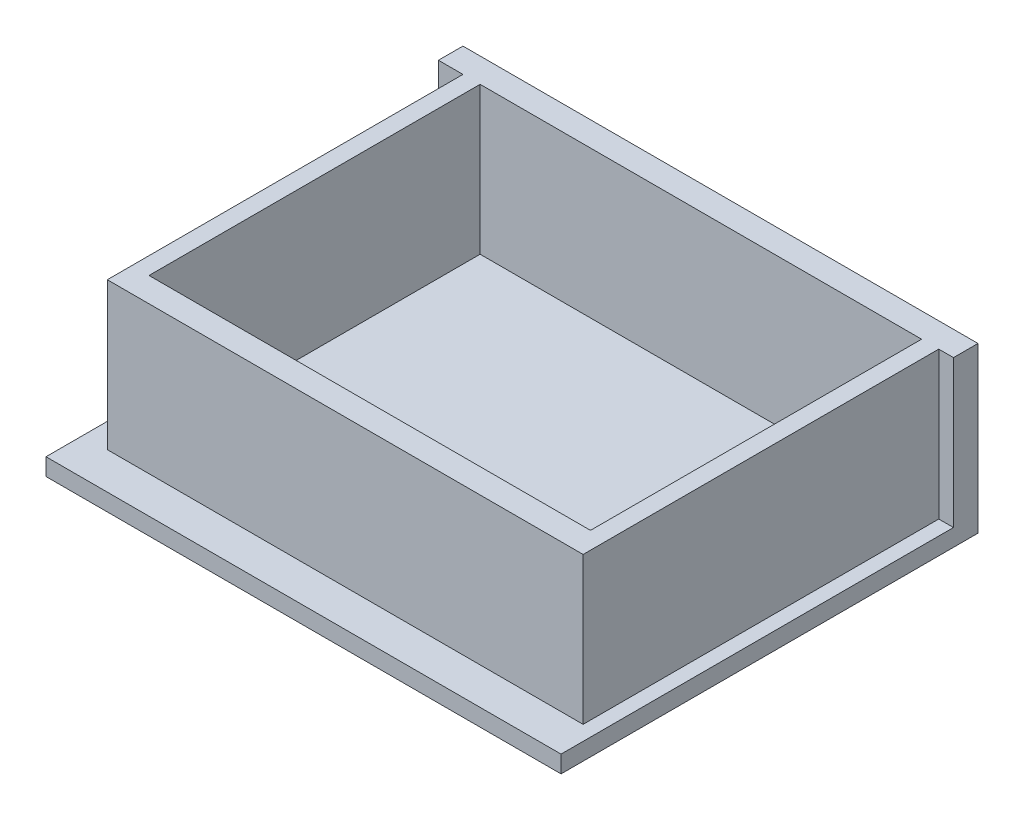
ISO-10303-21;
HEADER;
FILE_DESCRIPTION(('STEP AP214'),'2;1');
FILE_NAME('part.step','',(''),(''),'','','');
FILE_SCHEMA(('AUTOMOTIVE_DESIGN { 1 0 10303 214 1 1 1 1 }'));
ENDSEC;
DATA;
#1=APPLICATION_CONTEXT('core data for automotive mechanical design processes');
#2=APPLICATION_PROTOCOL_DEFINITION('international standard','automotive_design',2000,#1);
#3=PRODUCT_CONTEXT('',#1,'mechanical');
#4=PRODUCT('Part','Part','',(#3));
#5=PRODUCT_RELATED_PRODUCT_CATEGORY('part','',(#4));
#6=PRODUCT_DEFINITION_FORMATION('','',#4);
#7=PRODUCT_DEFINITION_CONTEXT('part definition',#1,'design');
#8=PRODUCT_DEFINITION('design','',#6,#7);
#9=PRODUCT_DEFINITION_SHAPE('','',#8);
#10=(LENGTH_UNIT() NAMED_UNIT(*) SI_UNIT(.MILLI.,.METRE.));
#11=(NAMED_UNIT(*) PLANE_ANGLE_UNIT() SI_UNIT($,.RADIAN.));
#12=(NAMED_UNIT(*) SI_UNIT($,.STERADIAN.) SOLID_ANGLE_UNIT());
#13=UNCERTAINTY_MEASURE_WITH_UNIT(LENGTH_MEASURE(1.E-05),#10,'distance_accuracy_value','');
#14=(GEOMETRIC_REPRESENTATION_CONTEXT(3) GLOBAL_UNCERTAINTY_ASSIGNED_CONTEXT((#13)) GLOBAL_UNIT_ASSIGNED_CONTEXT((#10,
#11,#12)) REPRESENTATION_CONTEXT('',''));
#15=CARTESIAN_POINT('',(0.,0.,0.));
#16=DIRECTION('',(0.,0.,1.));
#17=DIRECTION('',(1.,0.,0.));
#18=AXIS2_PLACEMENT_3D('',#15,#16,#17);
#19=CARTESIAN_POINT('',(0.,7.,0.));
#20=DIRECTION('',(0.,-1.,0.));
#21=DIRECTION('',(0.,0.,-1.));
#22=AXIS2_PLACEMENT_3D('',#19,#20,#21);
#23=PLANE('',#22);
#24=DIRECTION('',(1.,0.,0.));
#25=VECTOR('',#24,1.);
#26=CARTESIAN_POINT('',(0.,7.,-160.));
#27=LINE('',#26,#25);
#28=CARTESIAN_POINT('',(0.,7.,-160.));
#29=VERTEX_POINT('',#28);
#30=CARTESIAN_POINT('',(10.,7.,-160.));
#31=VERTEX_POINT('',#30);
#32=EDGE_CURVE('E205',#29,#31,#27,.T.);
#33=ORIENTED_EDGE('',*,*,#32,.F.);
#34=DIRECTION('',(0.,0.,1.));
#35=VECTOR('',#34,1.);
#36=CARTESIAN_POINT('',(0.,7.,0.));
#37=LINE('',#36,#35);
#38=CARTESIAN_POINT('',(0.,7.,0.));
#39=VERTEX_POINT('',#38);
#40=EDGE_CURVE('E245',#29,#39,#37,.T.);
#41=ORIENTED_EDGE('',*,*,#40,.T.);
#42=DIRECTION('',(1.,0.,0.));
#43=VECTOR('',#42,1.);
#44=CARTESIAN_POINT('',(0.,7.,0.));
#45=LINE('',#44,#43);
#46=CARTESIAN_POINT('',(210.,7.,0.));
#47=VERTEX_POINT('',#46);
#48=EDGE_CURVE('E244',#39,#47,#45,.T.);
#49=ORIENTED_EDGE('',*,*,#48,.T.);
#50=DIRECTION('',(0.,0.,-1.));
#51=VECTOR('',#50,1.);
#52=CARTESIAN_POINT('',(210.,7.,0.));
#53=LINE('',#52,#51);
#54=CARTESIAN_POINT('',(210.,7.,-160.));
#55=VERTEX_POINT('',#54);
#56=EDGE_CURVE('E206',#47,#55,#53,.T.);
#57=ORIENTED_EDGE('',*,*,#56,.T.);
#58=DIRECTION('',(1.,0.,0.));
#59=VECTOR('',#58,1.);
#60=CARTESIAN_POINT('',(0.,7.,-160.));
#61=LINE('',#60,#59);
#62=CARTESIAN_POINT('',(204.,7.,-160.));
#63=VERTEX_POINT('',#62);
#64=EDGE_CURVE('E198',#63,#55,#61,.T.);
#65=ORIENTED_EDGE('',*,*,#64,.F.);
#66=DIRECTION('',(0.,0.,-1.));
#67=VECTOR('',#66,1.);
#68=CARTESIAN_POINT('',(204.,7.,0.));
#69=LINE('',#68,#67);
#70=CARTESIAN_POINT('',(204.,7.,-15.));
#71=VERTEX_POINT('',#70);
#72=EDGE_CURVE('E195',#71,#63,#69,.T.);
#73=ORIENTED_EDGE('',*,*,#72,.F.);
#74=DIRECTION('',(-1.,0.,0.));
#75=VECTOR('',#74,1.);
#76=CARTESIAN_POINT('',(0.,7.,-15.));
#77=LINE('',#76,#75);
#78=CARTESIAN_POINT('',(10.,7.,-15.));
#79=VERTEX_POINT('',#78);
#80=EDGE_CURVE('E161',#71,#79,#77,.T.);
#81=ORIENTED_EDGE('',*,*,#80,.T.);
#82=DIRECTION('',(0.,0.,1.));
#83=VECTOR('',#82,1.);
#84=CARTESIAN_POINT('',(10.,7.,0.));
#85=LINE('',#84,#83);
#86=EDGE_CURVE('E163',#31,#79,#85,.T.);
#87=ORIENTED_EDGE('',*,*,#86,.F.);
#88=EDGE_LOOP('',(#33,#41,#49,#57,#65,#73,#81,#87));
#89=FACE_BOUND('',#88,.T.);
#90=ADVANCED_FACE('F35',(#89),#23,.F.);
#91=CARTESIAN_POINT('',(0.,7.,0.));
#92=DIRECTION('',(1.,0.,0.));
#93=DIRECTION('',(0.,0.,-1.));
#94=AXIS2_PLACEMENT_3D('',#91,#92,#93);
#95=PLANE('',#94);
#96=DIRECTION('',(0.,0.,1.));
#97=VECTOR('',#96,1.);
#98=CARTESIAN_POINT('',(0.,0.,0.));
#99=LINE('',#98,#97);
#100=CARTESIAN_POINT('',(0.,0.,-170.));
#101=VERTEX_POINT('',#100);
#102=CARTESIAN_POINT('',(0.,0.,0.));
#103=VERTEX_POINT('',#102);
#104=EDGE_CURVE('E237',#101,#103,#99,.T.);
#105=ORIENTED_EDGE('',*,*,#104,.T.);
#106=DIRECTION('',(0.,-1.,0.));
#107=VECTOR('',#106,1.);
#108=CARTESIAN_POINT('',(0.,7.,0.));
#109=LINE('',#108,#107);
#110=EDGE_CURVE('E11',#39,#103,#109,.T.);
#111=ORIENTED_EDGE('',*,*,#110,.F.);
#112=ORIENTED_EDGE('',*,*,#40,.F.);
#113=DIRECTION('',(0.,-1.,0.));
#114=VECTOR('',#113,1.);
#115=CARTESIAN_POINT('',(0.,67.,-160.));
#116=LINE('',#115,#114);
#117=CARTESIAN_POINT('',(0.,67.,-160.));
#118=VERTEX_POINT('',#117);
#119=EDGE_CURVE('E213',#118,#29,#116,.T.);
#120=ORIENTED_EDGE('',*,*,#119,.F.);
#121=DIRECTION('',(0.,0.,1.));
#122=VECTOR('',#121,1.);
#123=CARTESIAN_POINT('',(0.,67.,0.));
#124=LINE('',#123,#122);
#125=CARTESIAN_POINT('',(0.,67.,-170.));
#126=VERTEX_POINT('',#125);
#127=EDGE_CURVE('E179',#126,#118,#124,.T.);
#128=ORIENTED_EDGE('',*,*,#127,.F.);
#129=DIRECTION('',(0.,-1.,0.));
#130=VECTOR('',#129,1.);
#131=CARTESIAN_POINT('',(0.,7.,-170.));
#132=LINE('',#131,#130);
#133=EDGE_CURVE('E253',#126,#101,#132,.T.);
#134=ORIENTED_EDGE('',*,*,#133,.T.);
#135=EDGE_LOOP('',(#105,#111,#112,#120,#128,#134));
#136=FACE_BOUND('',#135,.T.);
#137=ADVANCED_FACE('F37',(#136),#95,.F.);
#138=CARTESIAN_POINT('',(0.,7.,0.));
#139=DIRECTION('',(0.,0.,-1.));
#140=DIRECTION('',(-1.,0.,0.));
#141=AXIS2_PLACEMENT_3D('',#138,#139,#140);
#142=PLANE('',#141);
#143=DIRECTION('',(1.,0.,0.));
#144=VECTOR('',#143,1.);
#145=CARTESIAN_POINT('',(0.,0.,0.));
#146=LINE('',#145,#144);
#147=CARTESIAN_POINT('',(210.,0.,0.));
#148=VERTEX_POINT('',#147);
#149=EDGE_CURVE('E259',#103,#148,#146,.T.);
#150=ORIENTED_EDGE('',*,*,#149,.T.);
#151=DIRECTION('',(0.,-1.,0.));
#152=VECTOR('',#151,1.);
#153=CARTESIAN_POINT('',(210.,7.,0.));
#154=LINE('',#153,#152);
#155=EDGE_CURVE('E44',#47,#148,#154,.T.);
#156=ORIENTED_EDGE('',*,*,#155,.F.);
#157=ORIENTED_EDGE('',*,*,#48,.F.);
#158=ORIENTED_EDGE('',*,*,#110,.T.);
#159=EDGE_LOOP('',(#150,#156,#157,#158));
#160=FACE_BOUND('',#159,.T.);
#161=ADVANCED_FACE('F275',(#160),#142,.F.);
#162=CARTESIAN_POINT('',(210.,7.,0.));
#163=DIRECTION('',(-1.,0.,0.));
#164=DIRECTION('',(0.,0.,1.));
#165=AXIS2_PLACEMENT_3D('',#162,#163,#164);
#166=PLANE('',#165);
#167=DIRECTION('',(0.,0.,-1.));
#168=VECTOR('',#167,1.);
#169=CARTESIAN_POINT('',(210.,0.,0.));
#170=LINE('',#169,#168);
#171=CARTESIAN_POINT('',(210.,0.,-170.));
#172=VERTEX_POINT('',#171);
#173=EDGE_CURVE('E257',#148,#172,#170,.T.);
#174=ORIENTED_EDGE('',*,*,#173,.T.);
#175=DIRECTION('',(0.,-1.,0.));
#176=VECTOR('',#175,1.);
#177=CARTESIAN_POINT('',(210.,7.,-170.));
#178=LINE('',#177,#176);
#179=CARTESIAN_POINT('',(210.,67.,-170.));
#180=VERTEX_POINT('',#179);
#181=EDGE_CURVE('E250',#180,#172,#178,.T.);
#182=ORIENTED_EDGE('',*,*,#181,.F.);
#183=DIRECTION('',(0.,0.,-1.));
#184=VECTOR('',#183,1.);
#185=CARTESIAN_POINT('',(210.,67.,0.));
#186=LINE('',#185,#184);
#187=CARTESIAN_POINT('',(210.,67.,-160.));
#188=VERTEX_POINT('',#187);
#189=EDGE_CURVE('E173',#188,#180,#186,.T.);
#190=ORIENTED_EDGE('',*,*,#189,.F.);
#191=DIRECTION('',(0.,-1.,0.));
#192=VECTOR('',#191,1.);
#193=CARTESIAN_POINT('',(210.,67.,-160.));
#194=LINE('',#193,#192);
#195=EDGE_CURVE('E209',#188,#55,#194,.T.);
#196=ORIENTED_EDGE('',*,*,#195,.T.);
#197=ORIENTED_EDGE('',*,*,#56,.F.);
#198=ORIENTED_EDGE('',*,*,#155,.T.);
#199=EDGE_LOOP('',(#174,#182,#190,#196,#197,#198));
#200=FACE_BOUND('',#199,.T.);
#201=ADVANCED_FACE('F284',(#200),#166,.F.);
#202=CARTESIAN_POINT('',(0.,7.,-170.));
#203=DIRECTION('',(0.,0.,1.));
#204=DIRECTION('',(1.,0.,0.));
#205=AXIS2_PLACEMENT_3D('',#202,#203,#204);
#206=PLANE('',#205);
#207=DIRECTION('',(-1.,0.,0.));
#208=VECTOR('',#207,1.);
#209=CARTESIAN_POINT('',(0.,0.,-170.));
#210=LINE('',#209,#208);
#211=EDGE_CURVE('E246',#172,#101,#210,.T.);
#212=ORIENTED_EDGE('',*,*,#211,.T.);
#213=ORIENTED_EDGE('',*,*,#133,.F.);
#214=DIRECTION('',(-1.,0.,0.));
#215=VECTOR('',#214,1.);
#216=CARTESIAN_POINT('',(0.,67.,-170.));
#217=LINE('',#216,#215);
#218=EDGE_CURVE('E176',#180,#126,#217,.T.);
#219=ORIENTED_EDGE('',*,*,#218,.F.);
#220=ORIENTED_EDGE('',*,*,#181,.T.);
#221=EDGE_LOOP('',(#212,#213,#219,#220));
#222=FACE_BOUND('',#221,.T.);
#223=ADVANCED_FACE('F287',(#222),#206,.F.);
#224=CARTESIAN_POINT('',(0.,0.,0.));
#225=DIRECTION('',(0.,-1.,0.));
#226=DIRECTION('',(0.,0.,-1.));
#227=AXIS2_PLACEMENT_3D('',#224,#225,#226);
#228=PLANE('',#227);
#229=ORIENTED_EDGE('',*,*,#104,.F.);
#230=ORIENTED_EDGE('',*,*,#211,.F.);
#231=ORIENTED_EDGE('',*,*,#173,.F.);
#232=ORIENTED_EDGE('',*,*,#149,.F.);
#233=EDGE_LOOP('',(#229,#230,#231,#232));
#234=FACE_BOUND('',#233,.T.);
#235=ADVANCED_FACE('F270',(#234),#228,.T.);
#236=CARTESIAN_POINT('',(204.,67.,0.));
#237=DIRECTION('',(-1.,0.,0.));
#238=DIRECTION('',(0.,0.,1.));
#239=AXIS2_PLACEMENT_3D('',#236,#237,#238);
#240=PLANE('',#239);
#241=ORIENTED_EDGE('',*,*,#72,.T.);
#242=DIRECTION('',(0.,-1.,0.));
#243=VECTOR('',#242,1.);
#244=CARTESIAN_POINT('',(204.,67.,-160.));
#245=LINE('',#244,#243);
#246=CARTESIAN_POINT('',(204.,67.,-160.));
#247=VERTEX_POINT('',#246);
#248=EDGE_CURVE('E212',#247,#63,#245,.T.);
#249=ORIENTED_EDGE('',*,*,#248,.F.);
#250=DIRECTION('',(0.,0.,-1.));
#251=VECTOR('',#250,1.);
#252=CARTESIAN_POINT('',(204.,67.,0.));
#253=LINE('',#252,#251);
#254=CARTESIAN_POINT('',(204.,67.,-15.));
#255=VERTEX_POINT('',#254);
#256=EDGE_CURVE('E168',#255,#247,#253,.T.);
#257=ORIENTED_EDGE('',*,*,#256,.F.);
#258=DIRECTION('',(0.,-1.,0.));
#259=VECTOR('',#258,1.);
#260=CARTESIAN_POINT('',(204.,67.,-15.));
#261=LINE('',#260,#259);
#262=EDGE_CURVE('E144',#255,#71,#261,.T.);
#263=ORIENTED_EDGE('',*,*,#262,.T.);
#264=EDGE_LOOP('',(#241,#249,#257,#263));
#265=FACE_BOUND('',#264,.T.);
#266=ADVANCED_FACE('F294',(#265),#240,.F.);
#267=CARTESIAN_POINT('',(0.,67.,-160.));
#268=DIRECTION('',(0.,0.,-1.));
#269=DIRECTION('',(-1.,0.,0.));
#270=AXIS2_PLACEMENT_3D('',#267,#268,#269);
#271=PLANE('',#270);
#272=ORIENTED_EDGE('',*,*,#64,.T.);
#273=ORIENTED_EDGE('',*,*,#195,.F.);
#274=DIRECTION('',(1.,0.,0.));
#275=VECTOR('',#274,1.);
#276=CARTESIAN_POINT('',(0.,67.,-160.));
#277=LINE('',#276,#275);
#278=EDGE_CURVE('E171',#247,#188,#277,.T.);
#279=ORIENTED_EDGE('',*,*,#278,.F.);
#280=ORIENTED_EDGE('',*,*,#248,.T.);
#281=EDGE_LOOP('',(#272,#273,#279,#280));
#282=FACE_BOUND('',#281,.T.);
#283=ADVANCED_FACE('F281',(#282),#271,.F.);
#284=CARTESIAN_POINT('',(0.,67.,-160.));
#285=DIRECTION('',(0.,0.,-1.));
#286=DIRECTION('',(-1.,0.,0.));
#287=AXIS2_PLACEMENT_3D('',#284,#285,#286);
#288=PLANE('',#287);
#289=ORIENTED_EDGE('',*,*,#32,.T.);
#290=DIRECTION('',(0.,-1.,0.));
#291=VECTOR('',#290,1.);
#292=CARTESIAN_POINT('',(10.,67.,-160.));
#293=LINE('',#292,#291);
#294=CARTESIAN_POINT('',(10.,67.,-160.));
#295=VERTEX_POINT('',#294);
#296=EDGE_CURVE('E220',#295,#31,#293,.T.);
#297=ORIENTED_EDGE('',*,*,#296,.F.);
#298=DIRECTION('',(1.,0.,0.));
#299=VECTOR('',#298,1.);
#300=CARTESIAN_POINT('',(0.,67.,-160.));
#301=LINE('',#300,#299);
#302=EDGE_CURVE('E181',#118,#295,#301,.T.);
#303=ORIENTED_EDGE('',*,*,#302,.F.);
#304=ORIENTED_EDGE('',*,*,#119,.T.);
#305=EDGE_LOOP('',(#289,#297,#303,#304));
#306=FACE_BOUND('',#305,.T.);
#307=ADVANCED_FACE('F333',(#306),#288,.F.);
#308=CARTESIAN_POINT('',(10.,67.,0.));
#309=DIRECTION('',(1.,0.,0.));
#310=DIRECTION('',(0.,0.,-1.));
#311=AXIS2_PLACEMENT_3D('',#308,#309,#310);
#312=PLANE('',#311);
#313=ORIENTED_EDGE('',*,*,#86,.T.);
#314=DIRECTION('',(0.,-1.,0.));
#315=VECTOR('',#314,1.);
#316=CARTESIAN_POINT('',(10.,67.,-15.));
#317=LINE('',#316,#315);
#318=CARTESIAN_POINT('',(10.,67.,-15.));
#319=VERTEX_POINT('',#318);
#320=EDGE_CURVE('E225',#319,#79,#317,.T.);
#321=ORIENTED_EDGE('',*,*,#320,.F.);
#322=DIRECTION('',(0.,0.,1.));
#323=VECTOR('',#322,1.);
#324=CARTESIAN_POINT('',(10.,67.,0.));
#325=LINE('',#324,#323);
#326=EDGE_CURVE('E183',#295,#319,#325,.T.);
#327=ORIENTED_EDGE('',*,*,#326,.F.);
#328=ORIENTED_EDGE('',*,*,#296,.T.);
#329=EDGE_LOOP('',(#313,#321,#327,#328));
#330=FACE_BOUND('',#329,.T.);
#331=ADVANCED_FACE('F329',(#330),#312,.F.);
#332=CARTESIAN_POINT('',(197.,67.,0.));
#333=DIRECTION('',(-1.,0.,0.));
#334=DIRECTION('',(0.,0.,1.));
#335=AXIS2_PLACEMENT_3D('',#332,#333,#334);
#336=PLANE('',#335);
#337=DIRECTION('',(0.,0.,-1.));
#338=VECTOR('',#337,1.);
#339=CARTESIAN_POINT('',(197.,7.,0.));
#340=LINE('',#339,#338);
#341=CARTESIAN_POINT('',(197.,7.,-25.));
#342=VERTEX_POINT('',#341);
#343=CARTESIAN_POINT('',(197.,7.,-160.));
#344=VERTEX_POINT('',#343);
#345=EDGE_CURVE('E52',#342,#344,#340,.T.);
#346=ORIENTED_EDGE('',*,*,#345,.F.);
#347=DIRECTION('',(0.,-1.,0.));
#348=VECTOR('',#347,1.);
#349=CARTESIAN_POINT('',(197.,67.,-25.));
#350=LINE('',#349,#348);
#351=CARTESIAN_POINT('',(197.,67.,-25.));
#352=VERTEX_POINT('',#351);
#353=EDGE_CURVE('E137',#352,#342,#350,.T.);
#354=ORIENTED_EDGE('',*,*,#353,.F.);
#355=DIRECTION('',(0.,0.,-1.));
#356=VECTOR('',#355,1.);
#357=CARTESIAN_POINT('',(197.,67.,0.));
#358=LINE('',#357,#356);
#359=CARTESIAN_POINT('',(197.,67.,-160.));
#360=VERTEX_POINT('',#359);
#361=EDGE_CURVE('E141',#352,#360,#358,.T.);
#362=ORIENTED_EDGE('',*,*,#361,.T.);
#363=DIRECTION('',(0.,-1.,0.));
#364=VECTOR('',#363,1.);
#365=CARTESIAN_POINT('',(197.,67.,-160.));
#366=LINE('',#365,#364);
#367=EDGE_CURVE('E188',#360,#344,#366,.T.);
#368=ORIENTED_EDGE('',*,*,#367,.T.);
#369=EDGE_LOOP('',(#346,#354,#362,#368));
#370=FACE_BOUND('',#369,.T.);
#371=ADVANCED_FACE('F139',(#370),#336,.T.);
#372=CARTESIAN_POINT('',(0.,67.,-25.));
#373=DIRECTION('',(0.,0.,1.));
#374=DIRECTION('',(1.,0.,0.));
#375=AXIS2_PLACEMENT_3D('',#372,#373,#374);
#376=PLANE('',#375);
#377=DIRECTION('',(-1.,0.,0.));
#378=VECTOR('',#377,1.);
#379=CARTESIAN_POINT('',(0.,7.,-25.));
#380=LINE('',#379,#378);
#381=CARTESIAN_POINT('',(17.,7.,-25.));
#382=VERTEX_POINT('',#381);
#383=EDGE_CURVE('E190',#342,#382,#380,.T.);
#384=ORIENTED_EDGE('',*,*,#383,.T.);
#385=DIRECTION('',(0.,-1.,0.));
#386=VECTOR('',#385,1.);
#387=CARTESIAN_POINT('',(17.,67.,-25.));
#388=LINE('',#387,#386);
#389=CARTESIAN_POINT('',(17.,67.,-25.));
#390=VERTEX_POINT('',#389);
#391=EDGE_CURVE('E145',#390,#382,#388,.T.);
#392=ORIENTED_EDGE('',*,*,#391,.F.);
#393=DIRECTION('',(-1.,0.,0.));
#394=VECTOR('',#393,1.);
#395=CARTESIAN_POINT('',(0.,67.,-25.));
#396=LINE('',#395,#394);
#397=EDGE_CURVE('E148',#352,#390,#396,.T.);
#398=ORIENTED_EDGE('',*,*,#397,.F.);
#399=ORIENTED_EDGE('',*,*,#353,.T.);
#400=EDGE_LOOP('',(#384,#392,#398,#399));
#401=FACE_BOUND('',#400,.T.);
#402=ADVANCED_FACE('F149',(#401),#376,.F.);
#403=CARTESIAN_POINT('',(17.,67.,0.));
#404=DIRECTION('',(1.,0.,0.));
#405=DIRECTION('',(0.,0.,-1.));
#406=AXIS2_PLACEMENT_3D('',#403,#404,#405);
#407=PLANE('',#406);
#408=DIRECTION('',(0.,0.,1.));
#409=VECTOR('',#408,1.);
#410=CARTESIAN_POINT('',(17.,7.,0.));
#411=LINE('',#410,#409);
#412=CARTESIAN_POINT('',(17.,7.,-160.));
#413=VERTEX_POINT('',#412);
#414=EDGE_CURVE('E192',#413,#382,#411,.T.);
#415=ORIENTED_EDGE('',*,*,#414,.F.);
#416=DIRECTION('',(0.,-1.,0.));
#417=VECTOR('',#416,1.);
#418=CARTESIAN_POINT('',(17.,67.,-160.));
#419=LINE('',#418,#417);
#420=CARTESIAN_POINT('',(17.,67.,-160.));
#421=VERTEX_POINT('',#420);
#422=EDGE_CURVE('E239',#421,#413,#419,.T.);
#423=ORIENTED_EDGE('',*,*,#422,.F.);
#424=DIRECTION('',(0.,0.,1.));
#425=VECTOR('',#424,1.);
#426=CARTESIAN_POINT('',(17.,67.,0.));
#427=LINE('',#426,#425);
#428=EDGE_CURVE('E154',#421,#390,#427,.T.);
#429=ORIENTED_EDGE('',*,*,#428,.T.);
#430=ORIENTED_EDGE('',*,*,#391,.T.);
#431=EDGE_LOOP('',(#415,#423,#429,#430));
#432=FACE_BOUND('',#431,.T.);
#433=ADVANCED_FACE('F312',(#432),#407,.T.);
#434=CARTESIAN_POINT('',(0.,67.,-160.));
#435=DIRECTION('',(0.,0.,-1.));
#436=DIRECTION('',(-1.,0.,0.));
#437=AXIS2_PLACEMENT_3D('',#434,#435,#436);
#438=PLANE('',#437);
#439=DIRECTION('',(1.,0.,0.));
#440=VECTOR('',#439,1.);
#441=CARTESIAN_POINT('',(0.,7.,-160.));
#442=LINE('',#441,#440);
#443=EDGE_CURVE('E57',#413,#344,#442,.T.);
#444=ORIENTED_EDGE('',*,*,#443,.T.);
#445=ORIENTED_EDGE('',*,*,#367,.F.);
#446=DIRECTION('',(1.,0.,0.));
#447=VECTOR('',#446,1.);
#448=CARTESIAN_POINT('',(0.,67.,-160.));
#449=LINE('',#448,#447);
#450=EDGE_CURVE('E159',#421,#360,#449,.T.);
#451=ORIENTED_EDGE('',*,*,#450,.F.);
#452=ORIENTED_EDGE('',*,*,#422,.T.);
#453=EDGE_LOOP('',(#444,#445,#451,#452));
#454=FACE_BOUND('',#453,.T.);
#455=ADVANCED_FACE('F314',(#454),#438,.F.);
#456=CARTESIAN_POINT('',(0.,67.,-15.));
#457=DIRECTION('',(0.,0.,1.));
#458=DIRECTION('',(1.,0.,0.));
#459=AXIS2_PLACEMENT_3D('',#456,#457,#458);
#460=PLANE('',#459);
#461=ORIENTED_EDGE('',*,*,#80,.F.);
#462=ORIENTED_EDGE('',*,*,#262,.F.);
#463=DIRECTION('',(-1.,0.,0.));
#464=VECTOR('',#463,1.);
#465=CARTESIAN_POINT('',(0.,67.,-15.));
#466=LINE('',#465,#464);
#467=EDGE_CURVE('E185',#255,#319,#466,.T.);
#468=ORIENTED_EDGE('',*,*,#467,.T.);
#469=ORIENTED_EDGE('',*,*,#320,.T.);
#470=EDGE_LOOP('',(#461,#462,#468,#469));
#471=FACE_BOUND('',#470,.T.);
#472=ADVANCED_FACE('F308',(#471),#460,.T.);
#473=CARTESIAN_POINT('',(0.,67.,0.));
#474=DIRECTION('',(0.,1.,0.));
#475=DIRECTION('',(0.,0.,1.));
#476=AXIS2_PLACEMENT_3D('',#473,#474,#475);
#477=PLANE('',#476);
#478=ORIENTED_EDGE('',*,*,#361,.F.);
#479=ORIENTED_EDGE('',*,*,#397,.T.);
#480=ORIENTED_EDGE('',*,*,#428,.F.);
#481=ORIENTED_EDGE('',*,*,#450,.T.);
#482=EDGE_LOOP('',(#478,#479,#480,#481));
#483=FACE_BOUND('',#482,.T.);
#484=ORIENTED_EDGE('',*,*,#256,.T.);
#485=ORIENTED_EDGE('',*,*,#278,.T.);
#486=ORIENTED_EDGE('',*,*,#189,.T.);
#487=ORIENTED_EDGE('',*,*,#218,.T.);
#488=ORIENTED_EDGE('',*,*,#127,.T.);
#489=ORIENTED_EDGE('',*,*,#302,.T.);
#490=ORIENTED_EDGE('',*,*,#326,.T.);
#491=ORIENTED_EDGE('',*,*,#467,.F.);
#492=EDGE_LOOP('',(#484,#485,#486,#487,#488,#489,#490,#491));
#493=FACE_BOUND('',#492,.T.);
#494=ADVANCED_FACE('F156',(#483,#493),#477,.T.);
#495=ORIENTED_EDGE('',*,*,#383,.F.);
#496=ORIENTED_EDGE('',*,*,#345,.T.);
#497=ORIENTED_EDGE('',*,*,#443,.F.);
#498=ORIENTED_EDGE('',*,*,#414,.T.);
#499=EDGE_LOOP('',(#495,#496,#497,#498));
#500=FACE_BOUND('',#499,.T.);
#501=ADVANCED_FACE('F299',(#500),#23,.F.);
#502=CLOSED_SHELL('',(#90,#137,#161,#201,#223,#235,#266,#283,#307,#331,#371,#402,#433,#455,#472,
#494,#501));
#503=MANIFOLD_SOLID_BREP('B2',#502);
#504=ADVANCED_BREP_SHAPE_REPRESENTATION('',(#18,#503),#14);
#505=SHAPE_DEFINITION_REPRESENTATION(#9,#504);
ENDSEC;
END-ISO-10303-21;
